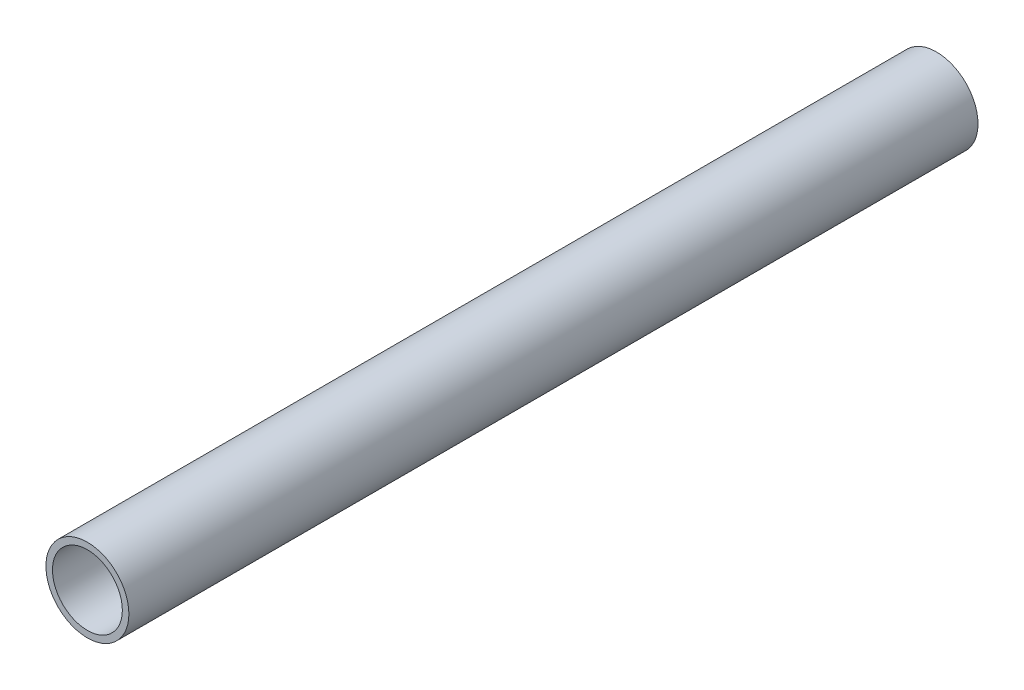
ISO-10303-21;
HEADER;
FILE_DESCRIPTION(('STEP AP214'),'2;1');
FILE_NAME('part.step','',(''),(''),'','','');
FILE_SCHEMA(('AUTOMOTIVE_DESIGN { 1 0 10303 214 1 1 1 1 }'));
ENDSEC;
DATA;
#1=APPLICATION_CONTEXT('core data for automotive mechanical design processes');
#2=APPLICATION_PROTOCOL_DEFINITION('international standard','automotive_design',2000,#1);
#3=PRODUCT_CONTEXT('',#1,'mechanical');
#4=PRODUCT('Part','Part','',(#3));
#5=PRODUCT_RELATED_PRODUCT_CATEGORY('part','',(#4));
#6=PRODUCT_DEFINITION_FORMATION('','',#4);
#7=PRODUCT_DEFINITION_CONTEXT('part definition',#1,'design');
#8=PRODUCT_DEFINITION('design','',#6,#7);
#9=PRODUCT_DEFINITION_SHAPE('','',#8);
#10=(LENGTH_UNIT() NAMED_UNIT(*) SI_UNIT(.MILLI.,.METRE.));
#11=(NAMED_UNIT(*) PLANE_ANGLE_UNIT() SI_UNIT($,.RADIAN.));
#12=(NAMED_UNIT(*) SI_UNIT($,.STERADIAN.) SOLID_ANGLE_UNIT());
#13=UNCERTAINTY_MEASURE_WITH_UNIT(LENGTH_MEASURE(1.E-05),#10,'distance_accuracy_value','');
#14=(GEOMETRIC_REPRESENTATION_CONTEXT(3) GLOBAL_UNCERTAINTY_ASSIGNED_CONTEXT((#13)) GLOBAL_UNIT_ASSIGNED_CONTEXT((#10,
#11,#12)) REPRESENTATION_CONTEXT('',''));
#15=CARTESIAN_POINT('',(0.,0.,0.));
#16=DIRECTION('',(0.,0.,1.));
#17=DIRECTION('',(1.,0.,0.));
#18=AXIS2_PLACEMENT_3D('',#15,#16,#17);
#19=CARTESIAN_POINT('',(0.,0.,260.));
#20=DIRECTION('',(0.,0.,1.));
#21=DIRECTION('',(1.,0.,0.));
#22=AXIS2_PLACEMENT_3D('',#19,#20,#21);
#23=PLANE('',#22);
#24=CARTESIAN_POINT('',(0.,0.,260.));
#25=DIRECTION('',(0.,0.,1.));
#26=DIRECTION('',(1.,0.,0.));
#27=AXIS2_PLACEMENT_3D('',#24,#25,#26);
#28=CIRCLE('',#27,12.7);
#29=CARTESIAN_POINT('',(12.7,0.,260.));
#30=VERTEX_POINT('',#29);
#31=EDGE_CURVE('E10',#30,#30,#28,.T.);
#32=ORIENTED_EDGE('',*,*,#31,.T.);
#33=EDGE_LOOP('',(#32));
#34=FACE_BOUND('',#33,.T.);
#35=CARTESIAN_POINT('',(0.,0.,260.));
#36=DIRECTION('',(0.,0.,1.));
#37=DIRECTION('',(1.,0.,0.));
#38=AXIS2_PLACEMENT_3D('',#35,#36,#37);
#39=CIRCLE('',#38,10.7);
#40=CARTESIAN_POINT('',(10.7,0.,260.));
#41=VERTEX_POINT('',#40);
#42=EDGE_CURVE('E41',#41,#41,#39,.T.);
#43=ORIENTED_EDGE('',*,*,#42,.F.);
#44=EDGE_LOOP('',(#43));
#45=FACE_BOUND('',#44,.T.);
#46=ADVANCED_FACE('F30',(#34,#45),#23,.T.);
#47=CARTESIAN_POINT('',(0.,0.,0.));
#48=DIRECTION('',(0.,0.,1.));
#49=DIRECTION('',(1.,0.,0.));
#50=AXIS2_PLACEMENT_3D('',#47,#48,#49);
#51=PLANE('',#50);
#52=CARTESIAN_POINT('',(0.,0.,0.));
#53=DIRECTION('',(0.,0.,1.));
#54=DIRECTION('',(1.,0.,0.));
#55=AXIS2_PLACEMENT_3D('',#52,#53,#54);
#56=CIRCLE('',#55,12.7);
#57=CARTESIAN_POINT('',(12.7,0.,0.));
#58=VERTEX_POINT('',#57);
#59=EDGE_CURVE('E34',#58,#58,#56,.T.);
#60=ORIENTED_EDGE('',*,*,#59,.F.);
#61=EDGE_LOOP('',(#60));
#62=FACE_BOUND('',#61,.T.);
#63=CARTESIAN_POINT('',(0.,0.,0.));
#64=DIRECTION('',(0.,0.,1.));
#65=DIRECTION('',(1.,0.,0.));
#66=AXIS2_PLACEMENT_3D('',#63,#64,#65);
#67=CIRCLE('',#66,10.7);
#68=CARTESIAN_POINT('',(10.7,0.,0.));
#69=VERTEX_POINT('',#68);
#70=EDGE_CURVE('E43',#69,#69,#67,.T.);
#71=ORIENTED_EDGE('',*,*,#70,.T.);
#72=EDGE_LOOP('',(#71));
#73=FACE_BOUND('',#72,.T.);
#74=ADVANCED_FACE('F53',(#62,#73),#51,.F.);
#75=CARTESIAN_POINT('',(0.,0.,260.));
#76=DIRECTION('',(0.,0.,-1.));
#77=DIRECTION('',(-1.,0.,0.));
#78=AXIS2_PLACEMENT_3D('',#75,#76,#77);
#79=CYLINDRICAL_SURFACE('',#78,12.7);
#80=ORIENTED_EDGE('',*,*,#31,.F.);
#81=EDGE_LOOP('',(#80));
#82=FACE_BOUND('',#81,.T.);
#83=ORIENTED_EDGE('',*,*,#59,.T.);
#84=EDGE_LOOP('',(#83));
#85=FACE_BOUND('',#84,.T.);
#86=ADVANCED_FACE('F32',(#82,#85),#79,.T.);
#87=CARTESIAN_POINT('',(0.,0.,260.));
#88=DIRECTION('',(0.,0.,-1.));
#89=DIRECTION('',(-1.,0.,0.));
#90=AXIS2_PLACEMENT_3D('',#87,#88,#89);
#91=CYLINDRICAL_SURFACE('',#90,10.7);
#92=ORIENTED_EDGE('',*,*,#42,.T.);
#93=EDGE_LOOP('',(#92));
#94=FACE_BOUND('',#93,.T.);
#95=ORIENTED_EDGE('',*,*,#70,.F.);
#96=EDGE_LOOP('',(#95));
#97=FACE_BOUND('',#96,.T.);
#98=ADVANCED_FACE('F49',(#94,#97),#91,.F.);
#99=CLOSED_SHELL('',(#46,#74,#86,#98));
#100=MANIFOLD_SOLID_BREP('B2',#99);
#101=ADVANCED_BREP_SHAPE_REPRESENTATION('',(#18,#100),#14);
#102=SHAPE_DEFINITION_REPRESENTATION(#9,#101);
ENDSEC;
END-ISO-10303-21;
